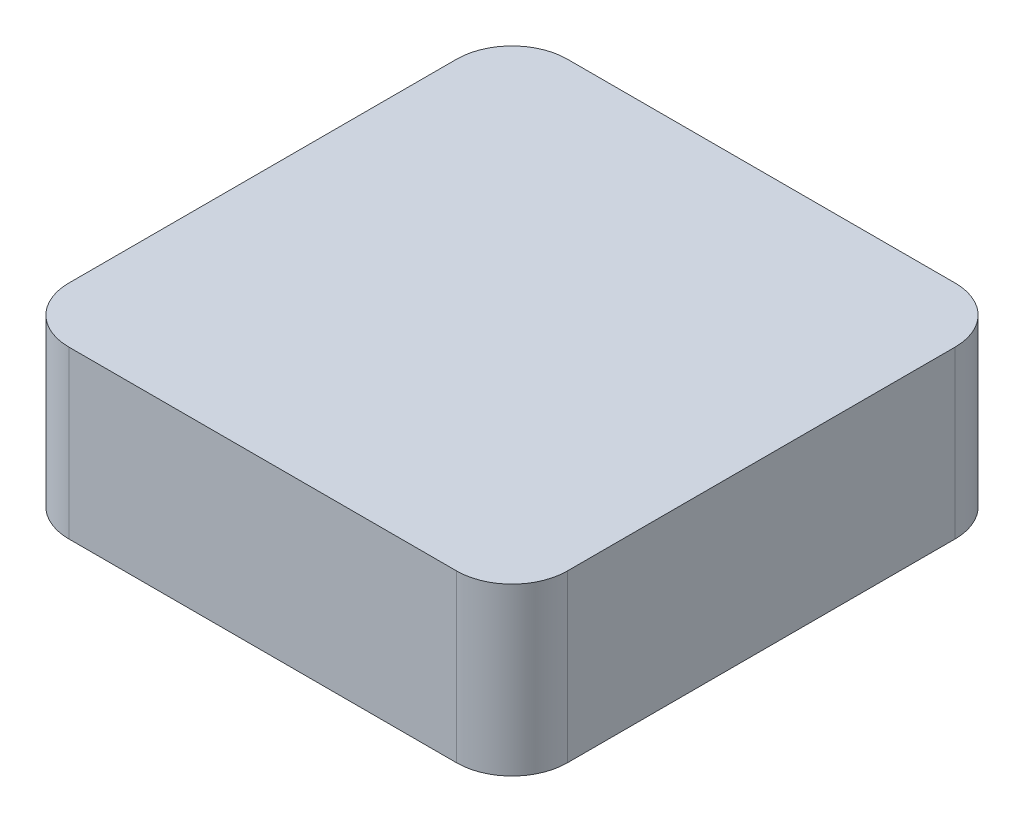
ISO-10303-21;
HEADER;
FILE_DESCRIPTION(('STEP AP214'),'2;1');
FILE_NAME('part.step','',(''),(''),'','','');
FILE_SCHEMA(('AUTOMOTIVE_DESIGN { 1 0 10303 214 1 1 1 1 }'));
ENDSEC;
DATA;
#1=APPLICATION_CONTEXT('core data for automotive mechanical design processes');
#2=APPLICATION_PROTOCOL_DEFINITION('international standard','automotive_design',2000,#1);
#3=PRODUCT_CONTEXT('',#1,'mechanical');
#4=PRODUCT('Part','Part','',(#3));
#5=PRODUCT_RELATED_PRODUCT_CATEGORY('part','',(#4));
#6=PRODUCT_DEFINITION_FORMATION('','',#4);
#7=PRODUCT_DEFINITION_CONTEXT('part definition',#1,'design');
#8=PRODUCT_DEFINITION('design','',#6,#7);
#9=PRODUCT_DEFINITION_SHAPE('','',#8);
#10=(LENGTH_UNIT() NAMED_UNIT(*) SI_UNIT(.MILLI.,.METRE.));
#11=(NAMED_UNIT(*) PLANE_ANGLE_UNIT() SI_UNIT($,.RADIAN.));
#12=(NAMED_UNIT(*) SI_UNIT($,.STERADIAN.) SOLID_ANGLE_UNIT());
#13=UNCERTAINTY_MEASURE_WITH_UNIT(LENGTH_MEASURE(1.E-05),#10,'distance_accuracy_value','');
#14=(GEOMETRIC_REPRESENTATION_CONTEXT(3) GLOBAL_UNCERTAINTY_ASSIGNED_CONTEXT((#13)) GLOBAL_UNIT_ASSIGNED_CONTEXT((#10,
#11,#12)) REPRESENTATION_CONTEXT('',''));
#15=CARTESIAN_POINT('',(0.,0.,0.));
#16=DIRECTION('',(0.,0.,1.));
#17=DIRECTION('',(1.,0.,0.));
#18=AXIS2_PLACEMENT_3D('',#15,#16,#17);
#19=CARTESIAN_POINT('',(-8.44393592677346,6.,-7.08466819221968));
#20=DIRECTION('',(1.,0.,0.));
#21=DIRECTION('',(0.,0.,-1.));
#22=AXIS2_PLACEMENT_3D('',#19,#20,#21);
#23=PLANE('',#22);
#24=DIRECTION('',(0.,0.,1.));
#25=VECTOR('',#24,1.);
#26=CARTESIAN_POINT('',(-8.44393592677346,0.,-7.08466819221968));
#27=LINE('',#26,#25);
#28=CARTESIAN_POINT('',(-8.44393592677346,0.,-5.08466819221968));
#29=VERTEX_POINT('',#28);
#30=CARTESIAN_POINT('',(-8.44393592677345,0.,8.91533180778032));
#31=VERTEX_POINT('',#30);
#32=EDGE_CURVE('E265',#29,#31,#27,.T.);
#33=ORIENTED_EDGE('',*,*,#32,.T.);
#34=DIRECTION('',(0.,-1.,0.));
#35=VECTOR('',#34,1.);
#36=CARTESIAN_POINT('',(-8.44393592677345,6.,8.91533180778032));
#37=LINE('',#36,#35);
#38=CARTESIAN_POINT('',(-8.44393592677345,6.,8.91533180778032));
#39=VERTEX_POINT('',#38);
#40=EDGE_CURVE('E342',#31,#39,#37,.F.);
#41=ORIENTED_EDGE('',*,*,#40,.T.);
#42=DIRECTION('',(0.,0.,1.));
#43=VECTOR('',#42,1.);
#44=CARTESIAN_POINT('',(-8.44393592677346,6.,-7.08466819221968));
#45=LINE('',#44,#43);
#46=CARTESIAN_POINT('',(-8.44393592677346,6.,-5.08466819221968));
#47=VERTEX_POINT('',#46);
#48=EDGE_CURVE('E291',#47,#39,#45,.T.);
#49=ORIENTED_EDGE('',*,*,#48,.F.);
#50=DIRECTION('',(0.,-1.,0.));
#51=VECTOR('',#50,1.);
#52=CARTESIAN_POINT('',(-8.44393592677346,6.,-5.08466819221968));
#53=LINE('',#52,#51);
#54=EDGE_CURVE('E338',#47,#29,#53,.T.);
#55=ORIENTED_EDGE('',*,*,#54,.T.);
#56=EDGE_LOOP('',(#33,#41,#49,#55));
#57=FACE_BOUND('',#56,.T.);
#58=ADVANCED_FACE('F47',(#57),#23,.F.);
#59=CARTESIAN_POINT('',(-8.44393592677345,6.,10.9153318077803));
#60=DIRECTION('',(0.,0.,-1.));
#61=DIRECTION('',(-1.,0.,0.));
#62=AXIS2_PLACEMENT_3D('',#59,#60,#61);
#63=PLANE('',#62);
#64=DIRECTION('',(1.,0.,0.));
#65=VECTOR('',#64,1.);
#66=CARTESIAN_POINT('',(-8.44393592677345,6.,10.9153318077803));
#67=LINE('',#66,#65);
#68=CARTESIAN_POINT('',(-6.44393592677345,6.,10.9153318077803));
#69=VERTEX_POINT('',#68);
#70=CARTESIAN_POINT('',(7.55606407322655,6.,10.9153318077803));
#71=VERTEX_POINT('',#70);
#72=EDGE_CURVE('E295',#69,#71,#67,.T.);
#73=ORIENTED_EDGE('',*,*,#72,.F.);
#74=DIRECTION('',(0.,-1.,0.));
#75=VECTOR('',#74,1.);
#76=CARTESIAN_POINT('',(-6.44393592677345,6.,10.9153318077803));
#77=LINE('',#76,#75);
#78=CARTESIAN_POINT('',(-6.44393592677345,0.,10.9153318077803));
#79=VERTEX_POINT('',#78);
#80=EDGE_CURVE('E322',#69,#79,#77,.T.);
#81=ORIENTED_EDGE('',*,*,#80,.T.);
#82=DIRECTION('',(1.,0.,0.));
#83=VECTOR('',#82,1.);
#84=CARTESIAN_POINT('',(-8.44393592677345,0.,10.9153318077803));
#85=LINE('',#84,#83);
#86=CARTESIAN_POINT('',(7.55606407322655,0.,10.9153318077803));
#87=VERTEX_POINT('',#86);
#88=EDGE_CURVE('E310',#79,#87,#85,.T.);
#89=ORIENTED_EDGE('',*,*,#88,.T.);
#90=DIRECTION('',(0.,-1.,0.));
#91=VECTOR('',#90,1.);
#92=CARTESIAN_POINT('',(7.55606407322655,6.,10.9153318077803));
#93=LINE('',#92,#91);
#94=EDGE_CURVE('E306',#87,#71,#93,.F.);
#95=ORIENTED_EDGE('',*,*,#94,.T.);
#96=EDGE_LOOP('',(#73,#81,#89,#95));
#97=FACE_BOUND('',#96,.T.);
#98=ADVANCED_FACE('F393',(#97),#63,.F.);
#99=CARTESIAN_POINT('',(9.55606407322654,6.,-7.08466819221968));
#100=DIRECTION('',(-1.,0.,0.));
#101=DIRECTION('',(0.,0.,1.));
#102=AXIS2_PLACEMENT_3D('',#99,#100,#101);
#103=PLANE('',#102);
#104=DIRECTION('',(0.,0.,-1.));
#105=VECTOR('',#104,1.);
#106=CARTESIAN_POINT('',(9.55606407322654,6.,-7.08466819221968));
#107=LINE('',#106,#105);
#108=CARTESIAN_POINT('',(9.55606407322655,6.,8.91533180778032));
#109=VERTEX_POINT('',#108);
#110=CARTESIAN_POINT('',(9.55606407322654,6.,-5.08466819221968));
#111=VERTEX_POINT('',#110);
#112=EDGE_CURVE('E300',#109,#111,#107,.T.);
#113=ORIENTED_EDGE('',*,*,#112,.F.);
#114=DIRECTION('',(0.,-1.,0.));
#115=VECTOR('',#114,1.);
#116=CARTESIAN_POINT('',(9.55606407322655,6.,8.91533180778032));
#117=LINE('',#116,#115);
#118=CARTESIAN_POINT('',(9.55606407322655,0.,8.91533180778032));
#119=VERTEX_POINT('',#118);
#120=EDGE_CURVE('E359',#109,#119,#117,.T.);
#121=ORIENTED_EDGE('',*,*,#120,.T.);
#122=DIRECTION('',(0.,0.,-1.));
#123=VECTOR('',#122,1.);
#124=CARTESIAN_POINT('',(9.55606407322654,0.,-7.08466819221968));
#125=LINE('',#124,#123);
#126=CARTESIAN_POINT('',(9.55606407322654,0.,-5.08466819221968));
#127=VERTEX_POINT('',#126);
#128=EDGE_CURVE('E314',#119,#127,#125,.T.);
#129=ORIENTED_EDGE('',*,*,#128,.T.);
#130=DIRECTION('',(0.,-1.,0.));
#131=VECTOR('',#130,1.);
#132=CARTESIAN_POINT('',(9.55606407322654,6.,-5.08466819221968));
#133=LINE('',#132,#131);
#134=EDGE_CURVE('E356',#127,#111,#133,.F.);
#135=ORIENTED_EDGE('',*,*,#134,.T.);
#136=EDGE_LOOP('',(#113,#121,#129,#135));
#137=FACE_BOUND('',#136,.T.);
#138=ADVANCED_FACE('F367',(#137),#103,.F.);
#139=CARTESIAN_POINT('',(-8.44393592677346,6.,-7.08466819221968));
#140=DIRECTION('',(0.,0.,1.));
#141=DIRECTION('',(1.,0.,0.));
#142=AXIS2_PLACEMENT_3D('',#139,#140,#141);
#143=PLANE('',#142);
#144=DIRECTION('',(-1.,0.,0.));
#145=VECTOR('',#144,1.);
#146=CARTESIAN_POINT('',(-8.44393592677346,6.,-7.08466819221968));
#147=LINE('',#146,#145);
#148=CARTESIAN_POINT('',(7.55606407322654,6.,-7.08466819221968));
#149=VERTEX_POINT('',#148);
#150=CARTESIAN_POINT('',(-6.44393592677346,6.,-7.08466819221968));
#151=VERTEX_POINT('',#150);
#152=EDGE_CURVE('E303',#149,#151,#147,.T.);
#153=ORIENTED_EDGE('',*,*,#152,.F.);
#154=DIRECTION('',(0.,-1.,0.));
#155=VECTOR('',#154,1.);
#156=CARTESIAN_POINT('',(7.55606407322654,6.,-7.08466819221968));
#157=LINE('',#156,#155);
#158=CARTESIAN_POINT('',(7.55606407322654,0.,-7.08466819221968));
#159=VERTEX_POINT('',#158);
#160=EDGE_CURVE('E11',#149,#159,#157,.T.);
#161=ORIENTED_EDGE('',*,*,#160,.T.);
#162=DIRECTION('',(-1.,0.,0.));
#163=VECTOR('',#162,1.);
#164=CARTESIAN_POINT('',(-8.44393592677346,0.,-7.08466819221968));
#165=LINE('',#164,#163);
#166=CARTESIAN_POINT('',(-6.44393592677346,0.,-7.08466819221968));
#167=VERTEX_POINT('',#166);
#168=EDGE_CURVE('E296',#159,#167,#165,.T.);
#169=ORIENTED_EDGE('',*,*,#168,.T.);
#170=DIRECTION('',(0.,-1.,0.));
#171=VECTOR('',#170,1.);
#172=CARTESIAN_POINT('',(-6.44393592677346,6.,-7.08466819221968));
#173=LINE('',#172,#171);
#174=EDGE_CURVE('E56',#167,#151,#173,.F.);
#175=ORIENTED_EDGE('',*,*,#174,.T.);
#176=EDGE_LOOP('',(#153,#161,#169,#175));
#177=FACE_BOUND('',#176,.T.);
#178=ADVANCED_FACE('F378',(#177),#143,.F.);
#179=CARTESIAN_POINT('',(0.,6.,0.));
#180=DIRECTION('',(0.,1.,0.));
#181=DIRECTION('',(0.,0.,1.));
#182=AXIS2_PLACEMENT_3D('',#179,#180,#181);
#183=PLANE('',#182);
#184=ORIENTED_EDGE('',*,*,#48,.T.);
#185=CARTESIAN_POINT('',(-6.44393592677345,6.,8.91533180778032));
#186=DIRECTION('',(0.,1.,0.));
#187=DIRECTION('',(0.,0.,1.));
#188=AXIS2_PLACEMENT_3D('',#185,#186,#187);
#189=CIRCLE('',#188,2.);
#190=EDGE_CURVE('E353',#39,#69,#189,.T.);
#191=ORIENTED_EDGE('',*,*,#190,.T.);
#192=ORIENTED_EDGE('',*,*,#72,.T.);
#193=CARTESIAN_POINT('',(7.55606407322655,6.,8.91533180778032));
#194=DIRECTION('',(0.,1.,0.));
#195=DIRECTION('',(0.,0.,1.));
#196=AXIS2_PLACEMENT_3D('',#193,#194,#195);
#197=CIRCLE('',#196,2.);
#198=EDGE_CURVE('E350',#71,#109,#197,.T.);
#199=ORIENTED_EDGE('',*,*,#198,.T.);
#200=ORIENTED_EDGE('',*,*,#112,.T.);
#201=CARTESIAN_POINT('',(7.55606407322654,6.,-5.08466819221968));
#202=DIRECTION('',(0.,1.,0.));
#203=DIRECTION('',(0.,0.,1.));
#204=AXIS2_PLACEMENT_3D('',#201,#202,#203);
#205=CIRCLE('',#204,2.);
#206=EDGE_CURVE('E69',#111,#149,#205,.T.);
#207=ORIENTED_EDGE('',*,*,#206,.T.);
#208=ORIENTED_EDGE('',*,*,#152,.T.);
#209=CARTESIAN_POINT('',(-6.44393592677346,6.,-5.08466819221968));
#210=DIRECTION('',(0.,1.,0.));
#211=DIRECTION('',(0.,0.,1.));
#212=AXIS2_PLACEMENT_3D('',#209,#210,#211);
#213=CIRCLE('',#212,2.);
#214=EDGE_CURVE('E345',#151,#47,#213,.T.);
#215=ORIENTED_EDGE('',*,*,#214,.T.);
#216=EDGE_LOOP('',(#184,#191,#192,#199,#200,#207,#208,#215));
#217=FACE_BOUND('',#216,.T.);
#218=ADVANCED_FACE('F380',(#217),#183,.T.);
#219=CARTESIAN_POINT('',(0.,0.,0.));
#220=DIRECTION('',(0.,1.,0.));
#221=DIRECTION('',(0.,0.,1.));
#222=AXIS2_PLACEMENT_3D('',#219,#220,#221);
#223=PLANE('',#222);
#224=DIRECTION('',(1.,0.,0.));
#225=VECTOR('',#224,1.);
#226=CARTESIAN_POINT('',(-6.44393592677345,0.,-5.08466819221968));
#227=LINE('',#226,#225);
#228=CARTESIAN_POINT('',(-6.44393592677345,0.,-5.08466819221968));
#229=VERTEX_POINT('',#228);
#230=CARTESIAN_POINT('',(7.55606407322655,0.,-5.08466819221968));
#231=VERTEX_POINT('',#230);
#232=EDGE_CURVE('E244',#229,#231,#227,.T.);
#233=ORIENTED_EDGE('',*,*,#232,.F.);
#234=DIRECTION('',(0.,0.,-1.));
#235=VECTOR('',#234,1.);
#236=CARTESIAN_POINT('',(-6.44393592677346,0.,8.91533180778032));
#237=LINE('',#236,#235);
#238=CARTESIAN_POINT('',(-6.44393592677346,0.,8.91533180778032));
#239=VERTEX_POINT('',#238);
#240=EDGE_CURVE('E240',#239,#229,#237,.T.);
#241=ORIENTED_EDGE('',*,*,#240,.F.);
#242=DIRECTION('',(-1.,0.,0.));
#243=VECTOR('',#242,1.);
#244=CARTESIAN_POINT('',(-6.44393592677346,0.,8.91533180778032));
#245=LINE('',#244,#243);
#246=CARTESIAN_POINT('',(7.55606407322655,0.,8.91533180778032));
#247=VERTEX_POINT('',#246);
#248=EDGE_CURVE('E257',#247,#239,#245,.T.);
#249=ORIENTED_EDGE('',*,*,#248,.F.);
#250=DIRECTION('',(0.,0.,1.));
#251=VECTOR('',#250,1.);
#252=CARTESIAN_POINT('',(7.55606407322655,0.,8.91533180778032));
#253=LINE('',#252,#251);
#254=EDGE_CURVE('E253',#231,#247,#253,.T.);
#255=ORIENTED_EDGE('',*,*,#254,.F.);
#256=EDGE_LOOP('',(#233,#241,#249,#255));
#257=FACE_BOUND('',#256,.T.);
#258=ORIENTED_EDGE('',*,*,#88,.F.);
#259=CARTESIAN_POINT('',(-6.44393592677345,0.,8.91533180778032));
#260=DIRECTION('',(0.,1.,0.));
#261=DIRECTION('',(0.,0.,1.));
#262=AXIS2_PLACEMENT_3D('',#259,#260,#261);
#263=CIRCLE('',#262,2.);
#264=EDGE_CURVE('E335',#79,#31,#263,.F.);
#265=ORIENTED_EDGE('',*,*,#264,.T.);
#266=ORIENTED_EDGE('',*,*,#32,.F.);
#267=CARTESIAN_POINT('',(-6.44393592677346,0.,-5.08466819221968));
#268=DIRECTION('',(0.,1.,0.));
#269=DIRECTION('',(0.,0.,1.));
#270=AXIS2_PLACEMENT_3D('',#267,#268,#269);
#271=CIRCLE('',#270,2.);
#272=EDGE_CURVE('E326',#29,#167,#271,.F.);
#273=ORIENTED_EDGE('',*,*,#272,.T.);
#274=ORIENTED_EDGE('',*,*,#168,.F.);
#275=CARTESIAN_POINT('',(7.55606407322654,0.,-5.08466819221968));
#276=DIRECTION('',(0.,1.,0.));
#277=DIRECTION('',(0.,0.,1.));
#278=AXIS2_PLACEMENT_3D('',#275,#276,#277);
#279=CIRCLE('',#278,2.);
#280=EDGE_CURVE('E329',#159,#127,#279,.F.);
#281=ORIENTED_EDGE('',*,*,#280,.T.);
#282=ORIENTED_EDGE('',*,*,#128,.F.);
#283=CARTESIAN_POINT('',(7.55606407322655,0.,8.91533180778032));
#284=DIRECTION('',(0.,1.,0.));
#285=DIRECTION('',(0.,0.,1.));
#286=AXIS2_PLACEMENT_3D('',#283,#284,#285);
#287=CIRCLE('',#286,2.);
#288=EDGE_CURVE('E332',#119,#87,#287,.F.);
#289=ORIENTED_EDGE('',*,*,#288,.T.);
#290=EDGE_LOOP('',(#258,#265,#266,#273,#274,#281,#282,#289));
#291=FACE_BOUND('',#290,.T.);
#292=ADVANCED_FACE('F373',(#257,#291),#223,.F.);
#293=CARTESIAN_POINT('',(-6.44393592677346,0.,8.91533180778032));
#294=DIRECTION('',(-0.939692620785908,0.342020143325669,0.));
#295=DIRECTION('',(-0.342020143325669,-0.939692620785908,0.));
#296=AXIS2_PLACEMENT_3D('',#293,#294,#295);
#297=PLANE('',#296);
#298=ORIENTED_EDGE('',*,*,#240,.T.);
#299=DIRECTION('',(-0.323615577118185,-0.889126490715988,-0.323615577118185));
#300=VECTOR('',#299,1.);
#301=CARTESIAN_POINT('',(-4.97775734222395,4.0282925539377,-3.61848960767017));
#302=LINE('',#301,#300);
#303=CARTESIAN_POINT('',(-4.98805498970864,4.,-3.62878725515487));
#304=VERTEX_POINT('',#303);
#305=EDGE_CURVE('E267',#304,#229,#302,.T.);
#306=ORIENTED_EDGE('',*,*,#305,.F.);
#307=DIRECTION('',(0.,0.,-1.));
#308=VECTOR('',#307,1.);
#309=CARTESIAN_POINT('',(-4.98805498970864,4.,0.));
#310=LINE('',#309,#308);
#311=CARTESIAN_POINT('',(-4.98805498970864,4.,7.45945087071551));
#312=VERTEX_POINT('',#311);
#313=EDGE_CURVE('E261',#312,#304,#310,.T.);
#314=ORIENTED_EDGE('',*,*,#313,.F.);
#315=DIRECTION('',(-0.323615577118185,-0.889126490715988,0.323615577118185));
#316=VECTOR('',#315,1.);
#317=CARTESIAN_POINT('',(-6.44393592677346,0.,8.91533180778032));
#318=LINE('',#317,#316);
#319=EDGE_CURVE('E262',#312,#239,#318,.T.);
#320=ORIENTED_EDGE('',*,*,#319,.T.);
#321=EDGE_LOOP('',(#298,#306,#314,#320));
#322=FACE_BOUND('',#321,.T.);
#323=ADVANCED_FACE('F418',(#322),#297,.F.);
#324=CARTESIAN_POINT('',(-6.44393592677346,0.,8.91533180778032));
#325=DIRECTION('',(0.,0.342020143325669,0.939692620785908));
#326=DIRECTION('',(0.,-0.939692620785908,0.342020143325669));
#327=AXIS2_PLACEMENT_3D('',#324,#325,#326);
#328=PLANE('',#327);
#329=ORIENTED_EDGE('',*,*,#248,.T.);
#330=ORIENTED_EDGE('',*,*,#319,.F.);
#331=DIRECTION('',(-1.,0.,0.));
#332=VECTOR('',#331,1.);
#333=CARTESIAN_POINT('',(0.,4.,7.45945087071551));
#334=LINE('',#333,#332);
#335=CARTESIAN_POINT('',(6.10018313616173,4.,7.45945087071551));
#336=VERTEX_POINT('',#335);
#337=EDGE_CURVE('E272',#336,#312,#334,.T.);
#338=ORIENTED_EDGE('',*,*,#337,.F.);
#339=DIRECTION('',(0.323615577118185,-0.889126490715988,0.323615577118185));
#340=VECTOR('',#339,1.);
#341=CARTESIAN_POINT('',(7.55606407322655,0.,8.91533180778032));
#342=LINE('',#341,#340);
#343=EDGE_CURVE('E266',#336,#247,#342,.T.);
#344=ORIENTED_EDGE('',*,*,#343,.T.);
#345=EDGE_LOOP('',(#329,#330,#338,#344));
#346=FACE_BOUND('',#345,.T.);
#347=ADVANCED_FACE('F422',(#346),#328,.F.);
#348=CARTESIAN_POINT('',(7.55606407322655,0.,8.91533180778032));
#349=DIRECTION('',(0.939692620785908,0.342020143325669,0.));
#350=DIRECTION('',(-0.342020143325669,0.939692620785908,0.));
#351=AXIS2_PLACEMENT_3D('',#348,#349,#350);
#352=PLANE('',#351);
#353=ORIENTED_EDGE('',*,*,#254,.T.);
#354=ORIENTED_EDGE('',*,*,#343,.F.);
#355=DIRECTION('',(0.,0.,1.));
#356=VECTOR('',#355,1.);
#357=CARTESIAN_POINT('',(6.10018313616173,4.,0.));
#358=LINE('',#357,#356);
#359=CARTESIAN_POINT('',(6.10018313616173,4.,-3.62878725515487));
#360=VERTEX_POINT('',#359);
#361=EDGE_CURVE('E284',#360,#336,#358,.T.);
#362=ORIENTED_EDGE('',*,*,#361,.F.);
#363=DIRECTION('',(0.323615577118185,-0.889126490715988,-0.323615577118185));
#364=VECTOR('',#363,1.);
#365=CARTESIAN_POINT('',(6.08988548867704,4.0282925539377,-3.61848960767017));
#366=LINE('',#365,#364);
#367=EDGE_CURVE('E271',#360,#231,#366,.T.);
#368=ORIENTED_EDGE('',*,*,#367,.T.);
#369=EDGE_LOOP('',(#353,#354,#362,#368));
#370=FACE_BOUND('',#369,.T.);
#371=ADVANCED_FACE('F425',(#370),#352,.F.);
#372=CARTESIAN_POINT('',(-6.44393592677345,0.,-5.08466819221968));
#373=DIRECTION('',(0.,0.342020143325669,-0.939692620785908));
#374=DIRECTION('',(0.,0.939692620785908,0.342020143325669));
#375=AXIS2_PLACEMENT_3D('',#372,#373,#374);
#376=PLANE('',#375);
#377=ORIENTED_EDGE('',*,*,#232,.T.);
#378=ORIENTED_EDGE('',*,*,#367,.F.);
#379=DIRECTION('',(1.,0.,0.));
#380=VECTOR('',#379,1.);
#381=CARTESIAN_POINT('',(0.,4.,-3.62878725515487));
#382=LINE('',#381,#380);
#383=EDGE_CURVE('E280',#304,#360,#382,.T.);
#384=ORIENTED_EDGE('',*,*,#383,.F.);
#385=ORIENTED_EDGE('',*,*,#305,.T.);
#386=EDGE_LOOP('',(#377,#378,#384,#385));
#387=FACE_BOUND('',#386,.T.);
#388=ADVANCED_FACE('F429',(#387),#376,.F.);
#389=CARTESIAN_POINT('',(0.,4.,0.));
#390=DIRECTION('',(0.,-1.,0.));
#391=DIRECTION('',(0.,0.,-1.));
#392=AXIS2_PLACEMENT_3D('',#389,#390,#391);
#393=PLANE('',#392);
#394=CARTESIAN_POINT('',(0.556064073226547,4.,1.91533180778032));
#395=DIRECTION('',(0.,-1.,0.));
#396=DIRECTION('',(0.,0.,-1.));
#397=AXIS2_PLACEMENT_3D('',#394,#395,#396);
#398=CIRCLE('',#397,3.);
#399=CARTESIAN_POINT('',(0.556064073226547,4.,-1.08466819221968));
#400=VERTEX_POINT('',#399);
#401=EDGE_CURVE('E235',#400,#400,#398,.T.);
#402=ORIENTED_EDGE('',*,*,#401,.F.);
#403=EDGE_LOOP('',(#402));
#404=FACE_BOUND('',#403,.T.);
#405=ORIENTED_EDGE('',*,*,#313,.T.);
#406=ORIENTED_EDGE('',*,*,#383,.T.);
#407=ORIENTED_EDGE('',*,*,#361,.T.);
#408=ORIENTED_EDGE('',*,*,#337,.T.);
#409=EDGE_LOOP('',(#405,#406,#407,#408));
#410=FACE_BOUND('',#409,.T.);
#411=ADVANCED_FACE('F433',(#404,#410),#393,.T.);
#412=CARTESIAN_POINT('',(0.,0.,3.94033180778032));
#413=DIRECTION('',(0.,0.,1.));
#414=DIRECTION('',(1.,0.,0.));
#415=AXIS2_PLACEMENT_3D('',#412,#413,#414);
#416=PLANE('',#415);
#417=DIRECTION('',(1.,0.,0.));
#418=VECTOR('',#417,1.);
#419=CARTESIAN_POINT('',(0.,4.,3.94033180778032));
#420=LINE('',#419,#418);
#421=CARTESIAN_POINT('',(-0.118935926773455,4.,3.94033180778032));
#422=VERTEX_POINT('',#421);
#423=CARTESIAN_POINT('',(1.23106407322655,4.,3.94033180778032));
#424=VERTEX_POINT('',#423);
#425=EDGE_CURVE('E238',#422,#424,#420,.T.);
#426=ORIENTED_EDGE('',*,*,#425,.T.);
#427=DIRECTION('',(0.,1.,0.));
#428=VECTOR('',#427,1.);
#429=CARTESIAN_POINT('',(1.23106407322655,0.,3.94033180778032));
#430=LINE('',#429,#428);
#431=CARTESIAN_POINT('',(1.23106407322655,0.,3.94033180778032));
#432=VERTEX_POINT('',#431);
#433=EDGE_CURVE('E215',#432,#424,#430,.T.);
#434=ORIENTED_EDGE('',*,*,#433,.F.);
#435=DIRECTION('',(1.,0.,0.));
#436=VECTOR('',#435,1.);
#437=CARTESIAN_POINT('',(0.,0.,3.94033180778032));
#438=LINE('',#437,#436);
#439=CARTESIAN_POINT('',(-0.118935926773455,0.,3.94033180778032));
#440=VERTEX_POINT('',#439);
#441=EDGE_CURVE('E223',#440,#432,#438,.T.);
#442=ORIENTED_EDGE('',*,*,#441,.F.);
#443=DIRECTION('',(0.,1.,0.));
#444=VECTOR('',#443,1.);
#445=CARTESIAN_POINT('',(-0.118935926773455,0.,3.94033180778032));
#446=LINE('',#445,#444);
#447=EDGE_CURVE('E598',#440,#422,#446,.T.);
#448=ORIENTED_EDGE('',*,*,#447,.T.);
#449=EDGE_LOOP('',(#426,#434,#442,#448));
#450=FACE_BOUND('',#449,.T.);
#451=ADVANCED_FACE('F237',(#450),#416,.F.);
#452=CARTESIAN_POINT('',(1.23106407322655,0.,0.));
#453=DIRECTION('',(1.,0.,0.));
#454=DIRECTION('',(0.,0.,-1.));
#455=AXIS2_PLACEMENT_3D('',#452,#453,#454);
#456=PLANE('',#455);
#457=DIRECTION('',(0.,0.,-1.));
#458=VECTOR('',#457,1.);
#459=CARTESIAN_POINT('',(1.23106407322655,4.,0.));
#460=LINE('',#459,#458);
#461=CARTESIAN_POINT('',(1.23106407322655,4.,2.59033180778032));
#462=VERTEX_POINT('',#461);
#463=EDGE_CURVE('E484',#424,#462,#460,.T.);
#464=ORIENTED_EDGE('',*,*,#463,.T.);
#465=DIRECTION('',(0.,1.,0.));
#466=VECTOR('',#465,1.);
#467=CARTESIAN_POINT('',(1.23106407322655,0.,2.59033180778032));
#468=LINE('',#467,#466);
#469=CARTESIAN_POINT('',(1.23106407322655,0.,2.59033180778032));
#470=VERTEX_POINT('',#469);
#471=EDGE_CURVE('E218',#470,#462,#468,.T.);
#472=ORIENTED_EDGE('',*,*,#471,.F.);
#473=DIRECTION('',(0.,0.,-1.));
#474=VECTOR('',#473,1.);
#475=CARTESIAN_POINT('',(1.23106407322655,0.,0.));
#476=LINE('',#475,#474);
#477=EDGE_CURVE('E210',#432,#470,#476,.T.);
#478=ORIENTED_EDGE('',*,*,#477,.F.);
#479=ORIENTED_EDGE('',*,*,#433,.T.);
#480=EDGE_LOOP('',(#464,#472,#478,#479));
#481=FACE_BOUND('',#480,.T.);
#482=ADVANCED_FACE('F213',(#481),#456,.F.);
#483=CARTESIAN_POINT('',(0.,0.,2.59033180778032));
#484=DIRECTION('',(0.,0.,1.));
#485=DIRECTION('',(1.,0.,0.));
#486=AXIS2_PLACEMENT_3D('',#483,#484,#485);
#487=PLANE('',#486);
#488=DIRECTION('',(1.,0.,0.));
#489=VECTOR('',#488,1.);
#490=CARTESIAN_POINT('',(0.,4.,2.59033180778032));
#491=LINE('',#490,#489);
#492=CARTESIAN_POINT('',(2.58106407322655,4.,2.59033180778032));
#493=VERTEX_POINT('',#492);
#494=EDGE_CURVE('E486',#462,#493,#491,.T.);
#495=ORIENTED_EDGE('',*,*,#494,.T.);
#496=DIRECTION('',(0.,1.,0.));
#497=VECTOR('',#496,1.);
#498=CARTESIAN_POINT('',(2.58106407322655,0.,2.59033180778032));
#499=LINE('',#498,#497);
#500=CARTESIAN_POINT('',(2.58106407322655,0.,2.59033180778032));
#501=VERTEX_POINT('',#500);
#502=EDGE_CURVE('E246',#501,#493,#499,.T.);
#503=ORIENTED_EDGE('',*,*,#502,.F.);
#504=DIRECTION('',(1.,0.,0.));
#505=VECTOR('',#504,1.);
#506=CARTESIAN_POINT('',(0.,0.,2.59033180778032));
#507=LINE('',#506,#505);
#508=EDGE_CURVE('E222',#470,#501,#507,.T.);
#509=ORIENTED_EDGE('',*,*,#508,.F.);
#510=ORIENTED_EDGE('',*,*,#471,.T.);
#511=EDGE_LOOP('',(#495,#503,#509,#510));
#512=FACE_BOUND('',#511,.T.);
#513=ADVANCED_FACE('F447',(#512),#487,.F.);
#514=CARTESIAN_POINT('',(2.58106407322655,0.,0.));
#515=DIRECTION('',(-1.,0.,0.));
#516=DIRECTION('',(0.,0.,1.));
#517=AXIS2_PLACEMENT_3D('',#514,#515,#516);
#518=PLANE('',#517);
#519=DIRECTION('',(0.,0.,1.));
#520=VECTOR('',#519,1.);
#521=CARTESIAN_POINT('',(2.58106407322655,4.,0.));
#522=LINE('',#521,#520);
#523=CARTESIAN_POINT('',(2.58106407322655,4.,1.24033180778032));
#524=VERTEX_POINT('',#523);
#525=EDGE_CURVE('E492',#524,#493,#522,.T.);
#526=ORIENTED_EDGE('',*,*,#525,.F.);
#527=DIRECTION('',(0.,1.,0.));
#528=VECTOR('',#527,1.);
#529=CARTESIAN_POINT('',(2.58106407322655,0.,1.24033180778032));
#530=LINE('',#529,#528);
#531=CARTESIAN_POINT('',(2.58106407322655,0.,1.24033180778032));
#532=VERTEX_POINT('',#531);
#533=EDGE_CURVE('E568',#532,#524,#530,.T.);
#534=ORIENTED_EDGE('',*,*,#533,.F.);
#535=DIRECTION('',(0.,0.,1.));
#536=VECTOR('',#535,1.);
#537=CARTESIAN_POINT('',(2.58106407322655,0.,0.));
#538=LINE('',#537,#536);
#539=EDGE_CURVE('E578',#532,#501,#538,.T.);
#540=ORIENTED_EDGE('',*,*,#539,.T.);
#541=ORIENTED_EDGE('',*,*,#502,.T.);
#542=EDGE_LOOP('',(#526,#534,#540,#541));
#543=FACE_BOUND('',#542,.T.);
#544=ADVANCED_FACE('F443',(#543),#518,.T.);
#545=CARTESIAN_POINT('',(0.,0.,1.24033180778032));
#546=DIRECTION('',(0.,0.,1.));
#547=DIRECTION('',(1.,0.,0.));
#548=AXIS2_PLACEMENT_3D('',#545,#546,#547);
#549=PLANE('',#548);
#550=DIRECTION('',(1.,0.,0.));
#551=VECTOR('',#550,1.);
#552=CARTESIAN_POINT('',(0.,4.,1.24033180778032));
#553=LINE('',#552,#551);
#554=CARTESIAN_POINT('',(1.23106407322655,4.,1.24033180778032));
#555=VERTEX_POINT('',#554);
#556=EDGE_CURVE('E499',#555,#524,#553,.T.);
#557=ORIENTED_EDGE('',*,*,#556,.F.);
#558=DIRECTION('',(0.,1.,0.));
#559=VECTOR('',#558,1.);
#560=CARTESIAN_POINT('',(1.23106407322655,0.,1.24033180778032));
#561=LINE('',#560,#559);
#562=CARTESIAN_POINT('',(1.23106407322655,0.,1.24033180778032));
#563=VERTEX_POINT('',#562);
#564=EDGE_CURVE('E563',#563,#555,#561,.T.);
#565=ORIENTED_EDGE('',*,*,#564,.F.);
#566=DIRECTION('',(1.,0.,0.));
#567=VECTOR('',#566,1.);
#568=CARTESIAN_POINT('',(0.,0.,1.24033180778032));
#569=LINE('',#568,#567);
#570=EDGE_CURVE('E571',#563,#532,#569,.T.);
#571=ORIENTED_EDGE('',*,*,#570,.T.);
#572=ORIENTED_EDGE('',*,*,#533,.T.);
#573=EDGE_LOOP('',(#557,#565,#571,#572));
#574=FACE_BOUND('',#573,.T.);
#575=ADVANCED_FACE('F446',(#574),#549,.T.);
#576=CARTESIAN_POINT('',(1.23106407322655,4.,-0.109668192219678));
#577=VERTEX_POINT('',#576);
#578=EDGE_CURVE('E489',#555,#577,#460,.T.);
#579=ORIENTED_EDGE('',*,*,#578,.T.);
#580=DIRECTION('',(0.,1.,0.));
#581=VECTOR('',#580,1.);
#582=CARTESIAN_POINT('',(1.23106407322655,0.,-0.109668192219678));
#583=LINE('',#582,#581);
#584=CARTESIAN_POINT('',(1.23106407322655,0.,-0.109668192219678));
#585=VERTEX_POINT('',#584);
#586=EDGE_CURVE('E559',#585,#577,#583,.T.);
#587=ORIENTED_EDGE('',*,*,#586,.F.);
#588=EDGE_CURVE('E225',#563,#585,#476,.T.);
#589=ORIENTED_EDGE('',*,*,#588,.F.);
#590=ORIENTED_EDGE('',*,*,#564,.T.);
#591=EDGE_LOOP('',(#579,#587,#589,#590));
#592=FACE_BOUND('',#591,.T.);
#593=ADVANCED_FACE('F449',(#592),#456,.F.);
#594=CARTESIAN_POINT('',(0.,0.,-0.109668192219679));
#595=DIRECTION('',(0.,0.,1.));
#596=DIRECTION('',(1.,0.,0.));
#597=AXIS2_PLACEMENT_3D('',#594,#595,#596);
#598=PLANE('',#597);
#599=DIRECTION('',(1.,0.,0.));
#600=VECTOR('',#599,1.);
#601=CARTESIAN_POINT('',(0.,4.,-0.109668192219679));
#602=LINE('',#601,#600);
#603=CARTESIAN_POINT('',(-0.118935926773454,4.,-0.109668192219679));
#604=VERTEX_POINT('',#603);
#605=EDGE_CURVE('E498',#604,#577,#602,.T.);
#606=ORIENTED_EDGE('',*,*,#605,.F.);
#607=DIRECTION('',(0.,1.,0.));
#608=VECTOR('',#607,1.);
#609=CARTESIAN_POINT('',(-0.118935926773454,0.,-0.109668192219679));
#610=LINE('',#609,#608);
#611=CARTESIAN_POINT('',(-0.118935926773454,0.,-0.109668192219679));
#612=VERTEX_POINT('',#611);
#613=EDGE_CURVE('E552',#612,#604,#610,.T.);
#614=ORIENTED_EDGE('',*,*,#613,.F.);
#615=DIRECTION('',(1.,0.,0.));
#616=VECTOR('',#615,1.);
#617=CARTESIAN_POINT('',(0.,0.,-0.109668192219679));
#618=LINE('',#617,#616);
#619=EDGE_CURVE('E620',#612,#585,#618,.T.);
#620=ORIENTED_EDGE('',*,*,#619,.T.);
#621=ORIENTED_EDGE('',*,*,#586,.T.);
#622=EDGE_LOOP('',(#606,#614,#620,#621));
#623=FACE_BOUND('',#622,.T.);
#624=ADVANCED_FACE('F452',(#623),#598,.T.);
#625=CARTESIAN_POINT('',(-0.118935926773454,0.,0.));
#626=DIRECTION('',(1.,0.,0.));
#627=DIRECTION('',(0.,0.,-1.));
#628=AXIS2_PLACEMENT_3D('',#625,#626,#627);
#629=PLANE('',#628);
#630=DIRECTION('',(0.,0.,-1.));
#631=VECTOR('',#630,1.);
#632=CARTESIAN_POINT('',(-0.118935926773454,4.,0.));
#633=LINE('',#632,#631);
#634=CARTESIAN_POINT('',(-0.118935926773455,4.,1.24033180778032));
#635=VERTEX_POINT('',#634);
#636=EDGE_CURVE('E504',#635,#604,#633,.T.);
#637=ORIENTED_EDGE('',*,*,#636,.F.);
#638=DIRECTION('',(0.,1.,0.));
#639=VECTOR('',#638,1.);
#640=CARTESIAN_POINT('',(-0.118935926773455,0.,1.24033180778032));
#641=LINE('',#640,#639);
#642=CARTESIAN_POINT('',(-0.118935926773455,0.,1.24033180778032));
#643=VERTEX_POINT('',#642);
#644=EDGE_CURVE('E545',#643,#635,#641,.T.);
#645=ORIENTED_EDGE('',*,*,#644,.F.);
#646=DIRECTION('',(0.,0.,-1.));
#647=VECTOR('',#646,1.);
#648=CARTESIAN_POINT('',(-0.118935926773454,0.,0.));
#649=LINE('',#648,#647);
#650=EDGE_CURVE('E555',#643,#612,#649,.T.);
#651=ORIENTED_EDGE('',*,*,#650,.T.);
#652=ORIENTED_EDGE('',*,*,#613,.T.);
#653=EDGE_LOOP('',(#637,#645,#651,#652));
#654=FACE_BOUND('',#653,.T.);
#655=ADVANCED_FACE('F456',(#654),#629,.T.);
#656=CARTESIAN_POINT('',(-1.46893592677345,4.,1.24033180778032));
#657=VERTEX_POINT('',#656);
#658=EDGE_CURVE('E507',#657,#635,#553,.T.);
#659=ORIENTED_EDGE('',*,*,#658,.F.);
#660=DIRECTION('',(0.,1.,0.));
#661=VECTOR('',#660,1.);
#662=CARTESIAN_POINT('',(-1.46893592677345,0.,1.24033180778032));
#663=LINE('',#662,#661);
#664=CARTESIAN_POINT('',(-1.46893592677345,0.,1.24033180778032));
#665=VERTEX_POINT('',#664);
#666=EDGE_CURVE('E540',#665,#657,#663,.T.);
#667=ORIENTED_EDGE('',*,*,#666,.F.);
#668=EDGE_CURVE('E547',#665,#643,#569,.T.);
#669=ORIENTED_EDGE('',*,*,#668,.T.);
#670=ORIENTED_EDGE('',*,*,#644,.T.);
#671=EDGE_LOOP('',(#659,#667,#669,#670));
#672=FACE_BOUND('',#671,.T.);
#673=ADVANCED_FACE('F458',(#672),#549,.T.);
#674=CARTESIAN_POINT('',(-1.46893592677345,0.,0.));
#675=DIRECTION('',(-1.,0.,0.));
#676=DIRECTION('',(0.,0.,1.));
#677=AXIS2_PLACEMENT_3D('',#674,#675,#676);
#678=PLANE('',#677);
#679=DIRECTION('',(0.,0.,1.));
#680=VECTOR('',#679,1.);
#681=CARTESIAN_POINT('',(-1.46893592677345,4.,0.));
#682=LINE('',#681,#680);
#683=CARTESIAN_POINT('',(-1.46893592677345,4.,2.59033180778032));
#684=VERTEX_POINT('',#683);
#685=EDGE_CURVE('E513',#657,#684,#682,.T.);
#686=ORIENTED_EDGE('',*,*,#685,.T.);
#687=DIRECTION('',(0.,1.,0.));
#688=VECTOR('',#687,1.);
#689=CARTESIAN_POINT('',(-1.46893592677345,0.,2.59033180778032));
#690=LINE('',#689,#688);
#691=CARTESIAN_POINT('',(-1.46893592677345,0.,2.59033180778032));
#692=VERTEX_POINT('',#691);
#693=EDGE_CURVE('E537',#692,#684,#690,.T.);
#694=ORIENTED_EDGE('',*,*,#693,.F.);
#695=DIRECTION('',(0.,0.,1.));
#696=VECTOR('',#695,1.);
#697=CARTESIAN_POINT('',(-1.46893592677345,0.,0.));
#698=LINE('',#697,#696);
#699=EDGE_CURVE('E541',#665,#692,#698,.T.);
#700=ORIENTED_EDGE('',*,*,#699,.F.);
#701=ORIENTED_EDGE('',*,*,#666,.T.);
#702=EDGE_LOOP('',(#686,#694,#700,#701));
#703=FACE_BOUND('',#702,.T.);
#704=ADVANCED_FACE('F461',(#703),#678,.F.);
#705=CARTESIAN_POINT('',(-0.118935926773455,4.,2.59033180778032));
#706=VERTEX_POINT('',#705);
#707=EDGE_CURVE('E494',#684,#706,#491,.T.);
#708=ORIENTED_EDGE('',*,*,#707,.T.);
#709=DIRECTION('',(0.,1.,0.));
#710=VECTOR('',#709,1.);
#711=CARTESIAN_POINT('',(-0.118935926773455,0.,2.59033180778032));
#712=LINE('',#711,#710);
#713=CARTESIAN_POINT('',(-0.118935926773455,0.,2.59033180778032));
#714=VERTEX_POINT('',#713);
#715=EDGE_CURVE('E535',#714,#706,#712,.T.);
#716=ORIENTED_EDGE('',*,*,#715,.F.);
#717=EDGE_CURVE('E583',#692,#714,#507,.T.);
#718=ORIENTED_EDGE('',*,*,#717,.F.);
#719=ORIENTED_EDGE('',*,*,#693,.T.);
#720=EDGE_LOOP('',(#708,#716,#718,#719));
#721=FACE_BOUND('',#720,.T.);
#722=ADVANCED_FACE('F465',(#721),#487,.F.);
#723=EDGE_CURVE('E521',#422,#706,#633,.T.);
#724=ORIENTED_EDGE('',*,*,#723,.F.);
#725=ORIENTED_EDGE('',*,*,#447,.F.);
#726=EDGE_CURVE('E231',#440,#714,#649,.T.);
#727=ORIENTED_EDGE('',*,*,#726,.T.);
#728=ORIENTED_EDGE('',*,*,#715,.T.);
#729=EDGE_LOOP('',(#724,#725,#727,#728));
#730=FACE_BOUND('',#729,.T.);
#731=ADVANCED_FACE('F469',(#730),#629,.T.);
#732=CARTESIAN_POINT('',(0.556064073226547,0.,1.91533180778032));
#733=DIRECTION('',(0.,1.,0.));
#734=DIRECTION('',(0.,0.,1.));
#735=AXIS2_PLACEMENT_3D('',#732,#733,#734);
#736=CYLINDRICAL_SURFACE('',#735,3.);
#737=CARTESIAN_POINT('',(0.556064073226547,0.,1.91533180778032));
#738=DIRECTION('',(0.,-1.,0.));
#739=DIRECTION('',(0.,0.,-1.));
#740=AXIS2_PLACEMENT_3D('',#737,#738,#739);
#741=CIRCLE('',#740,3.);
#742=CARTESIAN_POINT('',(0.556064073226547,0.,-1.08466819221968));
#743=VERTEX_POINT('',#742);
#744=EDGE_CURVE('E589',#743,#743,#741,.T.);
#745=ORIENTED_EDGE('',*,*,#744,.F.);
#746=EDGE_LOOP('',(#745));
#747=FACE_BOUND('',#746,.T.);
#748=ORIENTED_EDGE('',*,*,#401,.T.);
#749=EDGE_LOOP('',(#748));
#750=FACE_BOUND('',#749,.T.);
#751=ADVANCED_FACE('F473',(#747,#750),#736,.T.);
#752=CARTESIAN_POINT('',(0.,0.,0.));
#753=DIRECTION('',(0.,-1.,0.));
#754=DIRECTION('',(0.,0.,-1.));
#755=AXIS2_PLACEMENT_3D('',#752,#753,#754);
#756=PLANE('',#755);
#757=ORIENTED_EDGE('',*,*,#441,.T.);
#758=ORIENTED_EDGE('',*,*,#477,.T.);
#759=ORIENTED_EDGE('',*,*,#508,.T.);
#760=ORIENTED_EDGE('',*,*,#539,.F.);
#761=ORIENTED_EDGE('',*,*,#570,.F.);
#762=ORIENTED_EDGE('',*,*,#588,.T.);
#763=ORIENTED_EDGE('',*,*,#619,.F.);
#764=ORIENTED_EDGE('',*,*,#650,.F.);
#765=ORIENTED_EDGE('',*,*,#668,.F.);
#766=ORIENTED_EDGE('',*,*,#699,.T.);
#767=ORIENTED_EDGE('',*,*,#717,.T.);
#768=ORIENTED_EDGE('',*,*,#726,.F.);
#769=EDGE_LOOP('',(#757,#758,#759,#760,#761,#762,#763,#764,#765,#766,#767,#768));
#770=FACE_BOUND('',#769,.T.);
#771=ORIENTED_EDGE('',*,*,#744,.T.);
#772=EDGE_LOOP('',(#771));
#773=FACE_BOUND('',#772,.T.);
#774=ADVANCED_FACE('F228',(#770,#773),#756,.T.);
#775=ORIENTED_EDGE('',*,*,#463,.F.);
#776=ORIENTED_EDGE('',*,*,#425,.F.);
#777=ORIENTED_EDGE('',*,*,#723,.T.);
#778=ORIENTED_EDGE('',*,*,#707,.F.);
#779=ORIENTED_EDGE('',*,*,#685,.F.);
#780=ORIENTED_EDGE('',*,*,#658,.T.);
#781=ORIENTED_EDGE('',*,*,#636,.T.);
#782=ORIENTED_EDGE('',*,*,#605,.T.);
#783=ORIENTED_EDGE('',*,*,#578,.F.);
#784=ORIENTED_EDGE('',*,*,#556,.T.);
#785=ORIENTED_EDGE('',*,*,#525,.T.);
#786=ORIENTED_EDGE('',*,*,#494,.F.);
#787=EDGE_LOOP('',(#775,#776,#777,#778,#779,#780,#781,#782,#783,#784,#785,#786));
#788=FACE_BOUND('',#787,.T.);
#789=ADVANCED_FACE('F402',(#788),#393,.T.);
#790=CARTESIAN_POINT('',(-6.44393592677345,6.,8.91533180778032));
#791=DIRECTION('',(0.,-1.,0.));
#792=DIRECTION('',(0.,0.,-1.));
#793=AXIS2_PLACEMENT_3D('',#790,#791,#792);
#794=CYLINDRICAL_SURFACE('',#793,2.);
#795=ORIENTED_EDGE('',*,*,#190,.F.);
#796=ORIENTED_EDGE('',*,*,#40,.F.);
#797=ORIENTED_EDGE('',*,*,#264,.F.);
#798=ORIENTED_EDGE('',*,*,#80,.F.);
#799=EDGE_LOOP('',(#795,#796,#797,#798));
#800=FACE_BOUND('',#799,.T.);
#801=ADVANCED_FACE('F390',(#800),#794,.T.);
#802=CARTESIAN_POINT('',(7.55606407322655,6.,8.91533180778032));
#803=DIRECTION('',(0.,-1.,0.));
#804=DIRECTION('',(0.,0.,-1.));
#805=AXIS2_PLACEMENT_3D('',#802,#803,#804);
#806=CYLINDRICAL_SURFACE('',#805,2.);
#807=ORIENTED_EDGE('',*,*,#198,.F.);
#808=ORIENTED_EDGE('',*,*,#94,.F.);
#809=ORIENTED_EDGE('',*,*,#288,.F.);
#810=ORIENTED_EDGE('',*,*,#120,.F.);
#811=EDGE_LOOP('',(#807,#808,#809,#810));
#812=FACE_BOUND('',#811,.T.);
#813=ADVANCED_FACE('F395',(#812),#806,.T.);
#814=CARTESIAN_POINT('',(7.55606407322654,6.,-5.08466819221968));
#815=DIRECTION('',(0.,-1.,0.));
#816=DIRECTION('',(0.,0.,-1.));
#817=AXIS2_PLACEMENT_3D('',#814,#815,#816);
#818=CYLINDRICAL_SURFACE('',#817,2.);
#819=ORIENTED_EDGE('',*,*,#206,.F.);
#820=ORIENTED_EDGE('',*,*,#134,.F.);
#821=ORIENTED_EDGE('',*,*,#280,.F.);
#822=ORIENTED_EDGE('',*,*,#160,.F.);
#823=EDGE_LOOP('',(#819,#820,#821,#822));
#824=FACE_BOUND('',#823,.T.);
#825=ADVANCED_FACE('F377',(#824),#818,.T.);
#826=CARTESIAN_POINT('',(-6.44393592677346,6.,-5.08466819221968));
#827=DIRECTION('',(0.,-1.,0.));
#828=DIRECTION('',(0.,0.,-1.));
#829=AXIS2_PLACEMENT_3D('',#826,#827,#828);
#830=CYLINDRICAL_SURFACE('',#829,2.);
#831=ORIENTED_EDGE('',*,*,#214,.F.);
#832=ORIENTED_EDGE('',*,*,#174,.F.);
#833=ORIENTED_EDGE('',*,*,#272,.F.);
#834=ORIENTED_EDGE('',*,*,#54,.F.);
#835=EDGE_LOOP('',(#831,#832,#833,#834));
#836=FACE_BOUND('',#835,.T.);
#837=ADVANCED_FACE('F49',(#836),#830,.T.);
#838=CLOSED_SHELL('',(#58,#98,#138,#178,#218,#292,#323,#347,#371,#388,#411,#451,#482,#513,#544,
#575,#593,#624,#655,#673,#704,#722,#731,#751,#774,#789,#801,#813,#825,#837));
#839=MANIFOLD_SOLID_BREP('B2',#838);
#840=ADVANCED_BREP_SHAPE_REPRESENTATION('',(#18,#839),#14);
#841=SHAPE_DEFINITION_REPRESENTATION(#9,#840);
ENDSEC;
END-ISO-10303-21;
